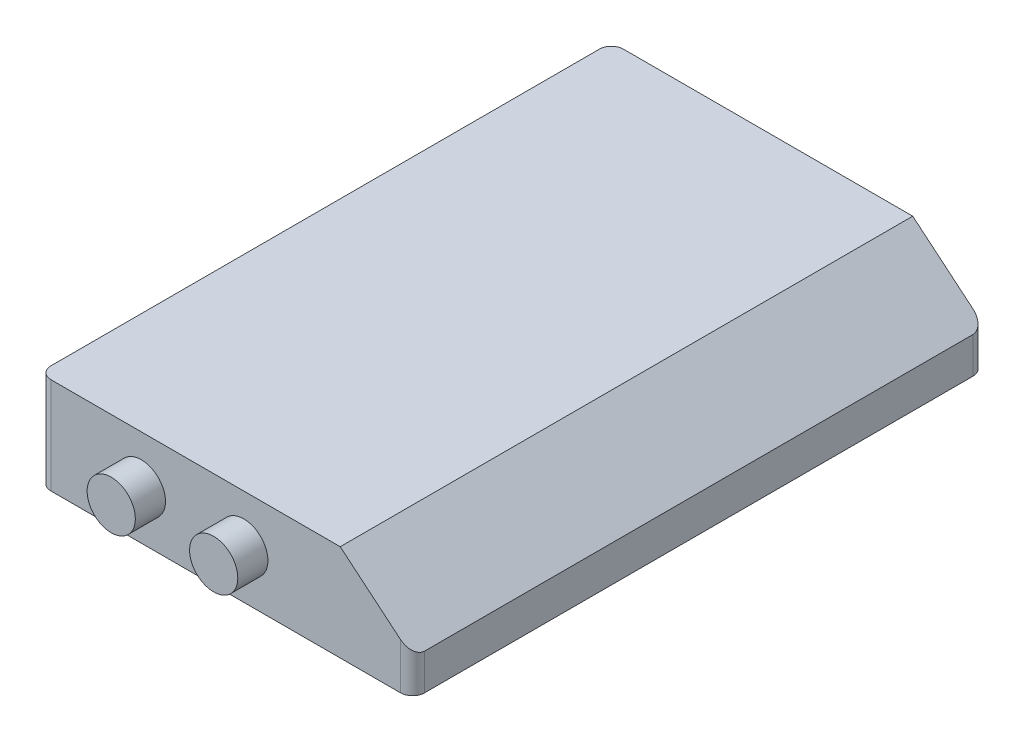
ISO-10303-21;
HEADER;
FILE_DESCRIPTION(('STEP AP214'),'2;1');
FILE_NAME('part.step','',(''),(''),'','','');
FILE_SCHEMA(('AUTOMOTIVE_DESIGN { 1 0 10303 214 1 1 1 1 }'));
ENDSEC;
DATA;
#1=APPLICATION_CONTEXT('core data for automotive mechanical design processes');
#2=APPLICATION_PROTOCOL_DEFINITION('international standard','automotive_design',2000,#1);
#3=PRODUCT_CONTEXT('',#1,'mechanical');
#4=PRODUCT('Part','Part','',(#3));
#5=PRODUCT_RELATED_PRODUCT_CATEGORY('part','',(#4));
#6=PRODUCT_DEFINITION_FORMATION('','',#4);
#7=PRODUCT_DEFINITION_CONTEXT('part definition',#1,'design');
#8=PRODUCT_DEFINITION('design','',#6,#7);
#9=PRODUCT_DEFINITION_SHAPE('','',#8);
#10=(LENGTH_UNIT() NAMED_UNIT(*) SI_UNIT(.MILLI.,.METRE.));
#11=(NAMED_UNIT(*) PLANE_ANGLE_UNIT() SI_UNIT($,.RADIAN.));
#12=(NAMED_UNIT(*) SI_UNIT($,.STERADIAN.) SOLID_ANGLE_UNIT());
#13=UNCERTAINTY_MEASURE_WITH_UNIT(LENGTH_MEASURE(1.E-05),#10,'distance_accuracy_value','');
#14=(GEOMETRIC_REPRESENTATION_CONTEXT(3) GLOBAL_UNCERTAINTY_ASSIGNED_CONTEXT((#13)) GLOBAL_UNIT_ASSIGNED_CONTEXT((#10,
#11,#12)) REPRESENTATION_CONTEXT('',''));
#15=CARTESIAN_POINT('',(0.,0.,0.));
#16=DIRECTION('',(0.,0.,1.));
#17=DIRECTION('',(1.,0.,0.));
#18=AXIS2_PLACEMENT_3D('',#15,#16,#17);
#19=CARTESIAN_POINT('',(0.,0.,-95.));
#20=DIRECTION('',(0.,-1.,0.));
#21=DIRECTION('',(0.,0.,-1.));
#22=AXIS2_PLACEMENT_3D('',#19,#20,#21);
#23=PLANE('',#22);
#24=DIRECTION('',(0.,0.,1.));
#25=VECTOR('',#24,1.);
#26=CARTESIAN_POINT('',(62.,0.,-95.));
#27=LINE('',#26,#25);
#28=CARTESIAN_POINT('',(62.,0.,-93.));
#29=VERTEX_POINT('',#28);
#30=CARTESIAN_POINT('',(62.,0.,-2.));
#31=VERTEX_POINT('',#30);
#32=EDGE_CURVE('E122',#29,#31,#27,.T.);
#33=ORIENTED_EDGE('',*,*,#32,.T.);
#34=CARTESIAN_POINT('',(60.,0.,-2.));
#35=DIRECTION('',(0.,-1.,0.));
#36=DIRECTION('',(0.,0.,-1.));
#37=AXIS2_PLACEMENT_3D('',#34,#35,#36);
#38=CIRCLE('',#37,2.);
#39=CARTESIAN_POINT('',(60.,0.,0.));
#40=VERTEX_POINT('',#39);
#41=EDGE_CURVE('E181',#31,#40,#38,.T.);
#42=ORIENTED_EDGE('',*,*,#41,.T.);
#43=DIRECTION('',(1.,0.,0.));
#44=VECTOR('',#43,1.);
#45=CARTESIAN_POINT('',(0.,0.,0.));
#46=LINE('',#45,#44);
#47=CARTESIAN_POINT('',(2.,0.,0.));
#48=VERTEX_POINT('',#47);
#49=EDGE_CURVE('E208',#48,#40,#46,.T.);
#50=ORIENTED_EDGE('',*,*,#49,.F.);
#51=CARTESIAN_POINT('',(2.,0.,-2.));
#52=DIRECTION('',(0.,-1.,0.));
#53=DIRECTION('',(0.,0.,-1.));
#54=AXIS2_PLACEMENT_3D('',#51,#52,#53);
#55=CIRCLE('',#54,2.);
#56=CARTESIAN_POINT('',(0.,0.,-2.));
#57=VERTEX_POINT('',#56);
#58=EDGE_CURVE('E172',#48,#57,#55,.T.);
#59=ORIENTED_EDGE('',*,*,#58,.T.);
#60=DIRECTION('',(0.,0.,1.));
#61=VECTOR('',#60,1.);
#62=CARTESIAN_POINT('',(0.,0.,-95.));
#63=LINE('',#62,#61);
#64=CARTESIAN_POINT('',(0.,0.,-93.));
#65=VERTEX_POINT('',#64);
#66=EDGE_CURVE('E144',#65,#57,#63,.T.);
#67=ORIENTED_EDGE('',*,*,#66,.F.);
#68=CARTESIAN_POINT('',(2.,0.,-93.));
#69=DIRECTION('',(0.,-1.,0.));
#70=DIRECTION('',(0.,0.,-1.));
#71=AXIS2_PLACEMENT_3D('',#68,#69,#70);
#72=CIRCLE('',#71,2.);
#73=CARTESIAN_POINT('',(2.,0.,-95.));
#74=VERTEX_POINT('',#73);
#75=EDGE_CURVE('E175',#65,#74,#72,.T.);
#76=ORIENTED_EDGE('',*,*,#75,.T.);
#77=DIRECTION('',(1.,0.,0.));
#78=VECTOR('',#77,1.);
#79=CARTESIAN_POINT('',(0.,0.,-95.));
#80=LINE('',#79,#78);
#81=CARTESIAN_POINT('',(60.,0.,-95.));
#82=VERTEX_POINT('',#81);
#83=EDGE_CURVE('E132',#74,#82,#80,.T.);
#84=ORIENTED_EDGE('',*,*,#83,.T.);
#85=CARTESIAN_POINT('',(60.,0.,-93.));
#86=DIRECTION('',(0.,-1.,0.));
#87=DIRECTION('',(0.,0.,-1.));
#88=AXIS2_PLACEMENT_3D('',#85,#86,#87);
#89=CIRCLE('',#88,2.);
#90=EDGE_CURVE('E178',#82,#29,#89,.T.);
#91=ORIENTED_EDGE('',*,*,#90,.T.);
#92=EDGE_LOOP('',(#33,#42,#50,#59,#67,#76,#84,#91));
#93=FACE_BOUND('',#92,.T.);
#94=ADVANCED_FACE('F39',(#93),#23,.T.);
#95=CARTESIAN_POINT('',(0.,0.,-95.));
#96=DIRECTION('',(1.,0.,0.));
#97=DIRECTION('',(0.,0.,-1.));
#98=AXIS2_PLACEMENT_3D('',#95,#96,#97);
#99=PLANE('',#98);
#100=DIRECTION('',(0.,0.,1.));
#101=VECTOR('',#100,1.);
#102=CARTESIAN_POINT('',(0.,16.,-95.));
#103=LINE('',#102,#101);
#104=CARTESIAN_POINT('',(0.,16.,-93.));
#105=VERTEX_POINT('',#104);
#106=CARTESIAN_POINT('',(0.,16.,-2.));
#107=VERTEX_POINT('',#106);
#108=EDGE_CURVE('E139',#105,#107,#103,.T.);
#109=ORIENTED_EDGE('',*,*,#108,.F.);
#110=DIRECTION('',(0.,1.,0.));
#111=VECTOR('',#110,1.);
#112=CARTESIAN_POINT('',(0.,0.,-93.));
#113=LINE('',#112,#111);
#114=EDGE_CURVE('E11',#105,#65,#113,.F.);
#115=ORIENTED_EDGE('',*,*,#114,.T.);
#116=ORIENTED_EDGE('',*,*,#66,.T.);
#117=DIRECTION('',(0.,1.,0.));
#118=VECTOR('',#117,1.);
#119=CARTESIAN_POINT('',(0.,16.,-2.));
#120=LINE('',#119,#118);
#121=EDGE_CURVE('E48',#57,#107,#120,.T.);
#122=ORIENTED_EDGE('',*,*,#121,.T.);
#123=EDGE_LOOP('',(#109,#115,#116,#122));
#124=FACE_BOUND('',#123,.T.);
#125=ADVANCED_FACE('F195',(#124),#99,.F.);
#126=CARTESIAN_POINT('',(0.,16.,-95.));
#127=DIRECTION('',(0.,-1.,0.));
#128=DIRECTION('',(0.,0.,-1.));
#129=AXIS2_PLACEMENT_3D('',#126,#127,#128);
#130=PLANE('',#129);
#131=DIRECTION('',(1.,0.,0.));
#132=VECTOR('',#131,1.);
#133=CARTESIAN_POINT('',(0.,16.,-95.));
#134=LINE('',#133,#132);
#135=CARTESIAN_POINT('',(2.,16.,-95.));
#136=VERTEX_POINT('',#135);
#137=CARTESIAN_POINT('',(50.,16.,-95.));
#138=VERTEX_POINT('',#137);
#139=EDGE_CURVE('E112',#136,#138,#134,.T.);
#140=ORIENTED_EDGE('',*,*,#139,.F.);
#141=CARTESIAN_POINT('',(2.,16.,-93.));
#142=DIRECTION('',(0.,-1.,0.));
#143=DIRECTION('',(0.,0.,-1.));
#144=AXIS2_PLACEMENT_3D('',#141,#142,#143);
#145=CIRCLE('',#144,2.);
#146=EDGE_CURVE('E63',#136,#105,#145,.F.);
#147=ORIENTED_EDGE('',*,*,#146,.T.);
#148=ORIENTED_EDGE('',*,*,#108,.T.);
#149=CARTESIAN_POINT('',(2.,16.,-2.));
#150=DIRECTION('',(0.,-1.,0.));
#151=DIRECTION('',(0.,0.,-1.));
#152=AXIS2_PLACEMENT_3D('',#149,#150,#151);
#153=CIRCLE('',#152,2.);
#154=CARTESIAN_POINT('',(2.,16.,0.));
#155=VERTEX_POINT('',#154);
#156=EDGE_CURVE('E55',#107,#155,#153,.F.);
#157=ORIENTED_EDGE('',*,*,#156,.T.);
#158=DIRECTION('',(1.,0.,0.));
#159=VECTOR('',#158,1.);
#160=CARTESIAN_POINT('',(0.,16.,0.));
#161=LINE('',#160,#159);
#162=CARTESIAN_POINT('',(50.,16.,0.));
#163=VERTEX_POINT('',#162);
#164=EDGE_CURVE('E136',#155,#163,#161,.T.);
#165=ORIENTED_EDGE('',*,*,#164,.T.);
#166=DIRECTION('',(0.,0.,1.));
#167=VECTOR('',#166,1.);
#168=CARTESIAN_POINT('',(50.,16.,-95.));
#169=LINE('',#168,#167);
#170=EDGE_CURVE('E128',#138,#163,#169,.T.);
#171=ORIENTED_EDGE('',*,*,#170,.F.);
#172=EDGE_LOOP('',(#140,#147,#148,#157,#165,#171));
#173=FACE_BOUND('',#172,.T.);
#174=ADVANCED_FACE('F134',(#173),#130,.F.);
#175=CARTESIAN_POINT('',(28.3606557377049,34.0327868852459,-95.));
#176=DIRECTION('',(0.64018439966448,0.768221279597376,0.));
#177=DIRECTION('',(-0.768221279597376,0.64018439966448,0.));
#178=AXIS2_PLACEMENT_3D('',#175,#176,#177);
#179=PLANE('',#178);
#180=DIRECTION('',(-0.768221279597376,0.64018439966448,0.));
#181=VECTOR('',#180,1.);
#182=CARTESIAN_POINT('',(28.3606557377049,34.0327868852459,0.));
#183=LINE('',#182,#181);
#184=CARTESIAN_POINT('',(60.,7.66666666666667,0.));
#185=VERTEX_POINT('',#184);
#186=EDGE_CURVE('E203',#185,#163,#183,.T.);
#187=ORIENTED_EDGE('',*,*,#186,.F.);
#188=CARTESIAN_POINT('',(60.,7.66666666666667,-2.));
#189=DIRECTION('',(0.64018439966448,0.768221279597376,0.));
#190=DIRECTION('',(-0.768221279597376,0.64018439966448,0.));
#191=AXIS2_PLACEMENT_3D('',#188,#189,#190);
#192=ELLIPSE('',#191,2.60341655863555,2.);
#193=CARTESIAN_POINT('',(62.,6.,-2.));
#194=VERTEX_POINT('',#193);
#195=EDGE_CURVE('E162',#185,#194,#192,.T.);
#196=ORIENTED_EDGE('',*,*,#195,.T.);
#197=DIRECTION('',(0.,0.,1.));
#198=VECTOR('',#197,1.);
#199=CARTESIAN_POINT('',(62.,6.,-95.));
#200=LINE('',#199,#198);
#201=CARTESIAN_POINT('',(62.,6.,-93.));
#202=VERTEX_POINT('',#201);
#203=EDGE_CURVE('E140',#202,#194,#200,.T.);
#204=ORIENTED_EDGE('',*,*,#203,.F.);
#205=CARTESIAN_POINT('',(60.,7.66666666666667,-93.));
#206=DIRECTION('',(0.64018439966448,0.768221279597376,0.));
#207=DIRECTION('',(0.768221279597376,-0.64018439966448,0.));
#208=AXIS2_PLACEMENT_3D('',#205,#206,#207);
#209=ELLIPSE('',#208,2.60341655863555,2.);
#210=CARTESIAN_POINT('',(60.,7.66666666666667,-95.));
#211=VERTEX_POINT('',#210);
#212=EDGE_CURVE('E130',#202,#211,#209,.T.);
#213=ORIENTED_EDGE('',*,*,#212,.T.);
#214=DIRECTION('',(-0.768221279597376,0.64018439966448,0.));
#215=VECTOR('',#214,1.);
#216=CARTESIAN_POINT('',(28.3606557377049,34.0327868852459,-95.));
#217=LINE('',#216,#215);
#218=EDGE_CURVE('E115',#211,#138,#217,.T.);
#219=ORIENTED_EDGE('',*,*,#218,.T.);
#220=ORIENTED_EDGE('',*,*,#170,.T.);
#221=EDGE_LOOP('',(#187,#196,#204,#213,#219,#220));
#222=FACE_BOUND('',#221,.T.);
#223=ADVANCED_FACE('F127',(#222),#179,.T.);
#224=CARTESIAN_POINT('',(62.,0.,-95.));
#225=DIRECTION('',(1.,0.,0.));
#226=DIRECTION('',(0.,0.,-1.));
#227=AXIS2_PLACEMENT_3D('',#224,#225,#226);
#228=PLANE('',#227);
#229=ORIENTED_EDGE('',*,*,#203,.T.);
#230=DIRECTION('',(0.,1.,0.));
#231=VECTOR('',#230,1.);
#232=CARTESIAN_POINT('',(62.,0.,-2.));
#233=LINE('',#232,#231);
#234=EDGE_CURVE('E169',#194,#31,#233,.F.);
#235=ORIENTED_EDGE('',*,*,#234,.T.);
#236=ORIENTED_EDGE('',*,*,#32,.F.);
#237=DIRECTION('',(0.,1.,0.));
#238=VECTOR('',#237,1.);
#239=CARTESIAN_POINT('',(62.,6.,-93.));
#240=LINE('',#239,#238);
#241=EDGE_CURVE('E165',#29,#202,#240,.T.);
#242=ORIENTED_EDGE('',*,*,#241,.T.);
#243=EDGE_LOOP('',(#229,#235,#236,#242));
#244=FACE_BOUND('',#243,.T.);
#245=ADVANCED_FACE('F273',(#244),#228,.T.);
#246=CARTESIAN_POINT('',(0.,0.,-95.));
#247=DIRECTION('',(0.,0.,1.));
#248=DIRECTION('',(1.,0.,0.));
#249=AXIS2_PLACEMENT_3D('',#246,#247,#248);
#250=PLANE('',#249);
#251=ORIENTED_EDGE('',*,*,#218,.F.);
#252=DIRECTION('',(0.,1.,0.));
#253=VECTOR('',#252,1.);
#254=CARTESIAN_POINT('',(60.,0.,-95.));
#255=LINE('',#254,#253);
#256=EDGE_CURVE('E186',#211,#82,#255,.F.);
#257=ORIENTED_EDGE('',*,*,#256,.T.);
#258=ORIENTED_EDGE('',*,*,#83,.F.);
#259=DIRECTION('',(0.,1.,0.));
#260=VECTOR('',#259,1.);
#261=CARTESIAN_POINT('',(2.,0.,-95.));
#262=LINE('',#261,#260);
#263=EDGE_CURVE('E119',#74,#136,#262,.T.);
#264=ORIENTED_EDGE('',*,*,#263,.T.);
#265=ORIENTED_EDGE('',*,*,#139,.T.);
#266=EDGE_LOOP('',(#251,#257,#258,#264,#265));
#267=FACE_BOUND('',#266,.T.);
#268=ADVANCED_FACE('F114',(#267),#250,.F.);
#269=CARTESIAN_POINT('',(0.,0.,0.));
#270=DIRECTION('',(0.,0.,1.));
#271=DIRECTION('',(1.,0.,0.));
#272=AXIS2_PLACEMENT_3D('',#269,#270,#271);
#273=PLANE('',#272);
#274=CARTESIAN_POINT('',(34.,8.,0.));
#275=DIRECTION('',(0.,0.,1.));
#276=DIRECTION('',(1.,0.,0.));
#277=AXIS2_PLACEMENT_3D('',#274,#275,#276);
#278=CIRCLE('',#277,4.00000000000001);
#279=CARTESIAN_POINT('',(38.,8.,0.));
#280=VERTEX_POINT('',#279);
#281=EDGE_CURVE('E229',#280,#280,#278,.T.);
#282=ORIENTED_EDGE('',*,*,#281,.F.);
#283=EDGE_LOOP('',(#282));
#284=FACE_BOUND('',#283,.T.);
#285=CARTESIAN_POINT('',(17.,8.,0.));
#286=DIRECTION('',(0.,0.,1.));
#287=DIRECTION('',(1.,0.,0.));
#288=AXIS2_PLACEMENT_3D('',#285,#286,#287);
#289=CIRCLE('',#288,4.);
#290=CARTESIAN_POINT('',(21.,8.,0.));
#291=VERTEX_POINT('',#290);
#292=EDGE_CURVE('E218',#291,#291,#289,.T.);
#293=ORIENTED_EDGE('',*,*,#292,.F.);
#294=EDGE_LOOP('',(#293));
#295=FACE_BOUND('',#294,.T.);
#296=ORIENTED_EDGE('',*,*,#49,.T.);
#297=DIRECTION('',(0.,1.,0.));
#298=VECTOR('',#297,1.);
#299=CARTESIAN_POINT('',(60.,0.,0.));
#300=LINE('',#299,#298);
#301=EDGE_CURVE('E156',#40,#185,#300,.T.);
#302=ORIENTED_EDGE('',*,*,#301,.T.);
#303=ORIENTED_EDGE('',*,*,#186,.T.);
#304=ORIENTED_EDGE('',*,*,#164,.F.);
#305=DIRECTION('',(0.,1.,0.));
#306=VECTOR('',#305,1.);
#307=CARTESIAN_POINT('',(2.,0.,0.));
#308=LINE('',#307,#306);
#309=EDGE_CURVE('E153',#155,#48,#308,.F.);
#310=ORIENTED_EDGE('',*,*,#309,.T.);
#311=EDGE_LOOP('',(#296,#302,#303,#304,#310));
#312=FACE_BOUND('',#311,.T.);
#313=ADVANCED_FACE('F201',(#284,#295,#312),#273,.T.);
#314=CARTESIAN_POINT('',(60.,0.,-2.));
#315=DIRECTION('',(0.,1.,0.));
#316=DIRECTION('',(0.,0.,1.));
#317=AXIS2_PLACEMENT_3D('',#314,#315,#316);
#318=CYLINDRICAL_SURFACE('',#317,2.);
#319=ORIENTED_EDGE('',*,*,#41,.F.);
#320=ORIENTED_EDGE('',*,*,#234,.F.);
#321=ORIENTED_EDGE('',*,*,#195,.F.);
#322=ORIENTED_EDGE('',*,*,#301,.F.);
#323=EDGE_LOOP('',(#319,#320,#321,#322));
#324=FACE_BOUND('',#323,.T.);
#325=ADVANCED_FACE('F248',(#324),#318,.T.);
#326=CARTESIAN_POINT('',(60.,0.,-93.));
#327=DIRECTION('',(0.,-1.,0.));
#328=DIRECTION('',(0.,0.,-1.));
#329=AXIS2_PLACEMENT_3D('',#326,#327,#328);
#330=CYLINDRICAL_SURFACE('',#329,2.);
#331=ORIENTED_EDGE('',*,*,#90,.F.);
#332=ORIENTED_EDGE('',*,*,#256,.F.);
#333=ORIENTED_EDGE('',*,*,#212,.F.);
#334=ORIENTED_EDGE('',*,*,#241,.F.);
#335=EDGE_LOOP('',(#331,#332,#333,#334));
#336=FACE_BOUND('',#335,.T.);
#337=ADVANCED_FACE('F277',(#336),#330,.T.);
#338=CARTESIAN_POINT('',(2.,0.,-93.));
#339=DIRECTION('',(0.,1.,0.));
#340=DIRECTION('',(0.,0.,1.));
#341=AXIS2_PLACEMENT_3D('',#338,#339,#340);
#342=CYLINDRICAL_SURFACE('',#341,2.);
#343=ORIENTED_EDGE('',*,*,#75,.F.);
#344=ORIENTED_EDGE('',*,*,#114,.F.);
#345=ORIENTED_EDGE('',*,*,#146,.F.);
#346=ORIENTED_EDGE('',*,*,#263,.F.);
#347=EDGE_LOOP('',(#343,#344,#345,#346));
#348=FACE_BOUND('',#347,.T.);
#349=ADVANCED_FACE('F262',(#348),#342,.T.);
#350=CARTESIAN_POINT('',(2.,0.,-2.));
#351=DIRECTION('',(0.,-1.,0.));
#352=DIRECTION('',(0.,0.,-1.));
#353=AXIS2_PLACEMENT_3D('',#350,#351,#352);
#354=CYLINDRICAL_SURFACE('',#353,2.);
#355=ORIENTED_EDGE('',*,*,#58,.F.);
#356=ORIENTED_EDGE('',*,*,#309,.F.);
#357=ORIENTED_EDGE('',*,*,#156,.F.);
#358=ORIENTED_EDGE('',*,*,#121,.F.);
#359=EDGE_LOOP('',(#355,#356,#357,#358));
#360=FACE_BOUND('',#359,.T.);
#361=ADVANCED_FACE('F41',(#360),#354,.T.);
#362=CARTESIAN_POINT('',(17.,8.,5.));
#363=DIRECTION('',(0.,0.,-1.));
#364=DIRECTION('',(-1.,0.,0.));
#365=AXIS2_PLACEMENT_3D('',#362,#363,#364);
#366=CYLINDRICAL_SURFACE('',#365,4.);
#367=CARTESIAN_POINT('',(17.,8.,5.));
#368=DIRECTION('',(0.,0.,1.));
#369=DIRECTION('',(1.,0.,0.));
#370=AXIS2_PLACEMENT_3D('',#367,#368,#369);
#371=CIRCLE('',#370,4.);
#372=CARTESIAN_POINT('',(21.,8.,5.));
#373=VERTEX_POINT('',#372);
#374=EDGE_CURVE('E212',#373,#373,#371,.T.);
#375=ORIENTED_EDGE('',*,*,#374,.F.);
#376=EDGE_LOOP('',(#375));
#377=FACE_BOUND('',#376,.T.);
#378=ORIENTED_EDGE('',*,*,#292,.T.);
#379=EDGE_LOOP('',(#378));
#380=FACE_BOUND('',#379,.T.);
#381=ADVANCED_FACE('F252',(#377,#380),#366,.T.);
#382=CARTESIAN_POINT('',(17.,8.,5.));
#383=DIRECTION('',(0.,0.,1.));
#384=DIRECTION('',(1.,0.,0.));
#385=AXIS2_PLACEMENT_3D('',#382,#383,#384);
#386=PLANE('',#385);
#387=ORIENTED_EDGE('',*,*,#374,.T.);
#388=EDGE_LOOP('',(#387));
#389=FACE_BOUND('',#388,.T.);
#390=ADVANCED_FACE('F242',(#389),#386,.T.);
#391=CARTESIAN_POINT('',(34.,8.,5.));
#392=DIRECTION('',(0.,0.,-1.));
#393=DIRECTION('',(-1.,0.,0.));
#394=AXIS2_PLACEMENT_3D('',#391,#392,#393);
#395=CYLINDRICAL_SURFACE('',#394,4.00000000000001);
#396=CARTESIAN_POINT('',(34.,8.,5.));
#397=DIRECTION('',(0.,0.,1.));
#398=DIRECTION('',(1.,0.,0.));
#399=AXIS2_PLACEMENT_3D('',#396,#397,#398);
#400=CIRCLE('',#399,4.00000000000001);
#401=CARTESIAN_POINT('',(38.,8.,5.));
#402=VERTEX_POINT('',#401);
#403=EDGE_CURVE('E227',#402,#402,#400,.T.);
#404=ORIENTED_EDGE('',*,*,#403,.F.);
#405=EDGE_LOOP('',(#404));
#406=FACE_BOUND('',#405,.T.);
#407=ORIENTED_EDGE('',*,*,#281,.T.);
#408=EDGE_LOOP('',(#407));
#409=FACE_BOUND('',#408,.T.);
#410=ADVANCED_FACE('F239',(#406,#409),#395,.T.);
#411=CARTESIAN_POINT('',(34.,8.,5.));
#412=DIRECTION('',(0.,0.,1.));
#413=DIRECTION('',(1.,0.,0.));
#414=AXIS2_PLACEMENT_3D('',#411,#412,#413);
#415=PLANE('',#414);
#416=ORIENTED_EDGE('',*,*,#403,.T.);
#417=EDGE_LOOP('',(#416));
#418=FACE_BOUND('',#417,.T.);
#419=ADVANCED_FACE('F237',(#418),#415,.T.);
#420=CLOSED_SHELL('',(#94,#125,#174,#223,#245,#268,#313,#325,#337,#349,#361,#381,#390,#410,#419));
#421=MANIFOLD_SOLID_BREP('B2',#420);
#422=ADVANCED_BREP_SHAPE_REPRESENTATION('',(#18,#421),#14);
#423=SHAPE_DEFINITION_REPRESENTATION(#9,#422);
ENDSEC;
END-ISO-10303-21;
